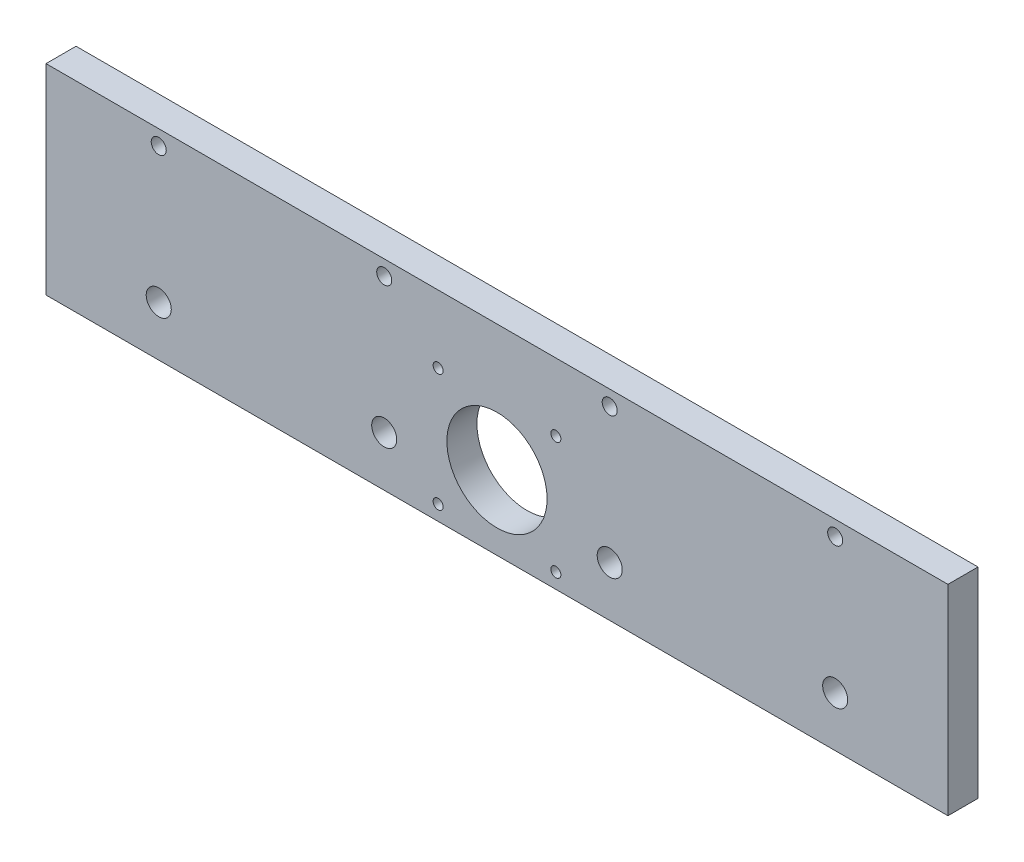
ISO-10303-21;
HEADER;
FILE_DESCRIPTION(('STEP AP214'),'2;1');
FILE_NAME('part.step','',(''),(''),'','','');
FILE_SCHEMA(('AUTOMOTIVE_DESIGN { 1 0 10303 214 1 1 1 1 }'));
ENDSEC;
DATA;
#1=APPLICATION_CONTEXT('core data for automotive mechanical design processes');
#2=APPLICATION_PROTOCOL_DEFINITION('international standard','automotive_design',2000,#1);
#3=PRODUCT_CONTEXT('',#1,'mechanical');
#4=PRODUCT('Part','Part','',(#3));
#5=PRODUCT_RELATED_PRODUCT_CATEGORY('part','',(#4));
#6=PRODUCT_DEFINITION_FORMATION('','',#4);
#7=PRODUCT_DEFINITION_CONTEXT('part definition',#1,'design');
#8=PRODUCT_DEFINITION('design','',#6,#7);
#9=PRODUCT_DEFINITION_SHAPE('','',#8);
#10=(LENGTH_UNIT() NAMED_UNIT(*) SI_UNIT(.MILLI.,.METRE.));
#11=(NAMED_UNIT(*) PLANE_ANGLE_UNIT() SI_UNIT($,.RADIAN.));
#12=(NAMED_UNIT(*) SI_UNIT($,.STERADIAN.) SOLID_ANGLE_UNIT());
#13=UNCERTAINTY_MEASURE_WITH_UNIT(LENGTH_MEASURE(1.E-05),#10,'distance_accuracy_value','');
#14=(GEOMETRIC_REPRESENTATION_CONTEXT(3) GLOBAL_UNCERTAINTY_ASSIGNED_CONTEXT((#13)) GLOBAL_UNIT_ASSIGNED_CONTEXT((#10,
#11,#12)) REPRESENTATION_CONTEXT('',''));
#15=CARTESIAN_POINT('',(0.,0.,0.));
#16=DIRECTION('',(0.,0.,1.));
#17=DIRECTION('',(1.,0.,0.));
#18=AXIS2_PLACEMENT_3D('',#15,#16,#17);
#19=CARTESIAN_POINT('',(180.,40.,12.));
#20=DIRECTION('',(0.,0.,-1.));
#21=DIRECTION('',(-1.,0.,0.));
#22=AXIS2_PLACEMENT_3D('',#19,#20,#21);
#23=PLANE('',#22);
#24=CARTESIAN_POINT('',(23.5,13.,12.));
#25=DIRECTION('',(0.,0.,-1.));
#26=DIRECTION('',(-1.,0.,0.));
#27=AXIS2_PLACEMENT_3D('',#24,#25,#26);
#28=CIRCLE('',#27,2.);
#29=CARTESIAN_POINT('',(21.5,13.,12.));
#30=VERTEX_POINT('',#29);
#31=EDGE_CURVE('E151',#30,#30,#28,.T.);
#32=ORIENTED_EDGE('',*,*,#31,.T.);
#33=EDGE_LOOP('',(#32));
#34=FACE_BOUND('',#33,.T.);
#35=CARTESIAN_POINT('',(-23.5,-34.,12.));
#36=DIRECTION('',(0.,0.,1.));
#37=DIRECTION('',(1.,0.,0.));
#38=AXIS2_PLACEMENT_3D('',#35,#36,#37);
#39=CIRCLE('',#38,2.00000000000001);
#40=CARTESIAN_POINT('',(-21.5,-34.,12.));
#41=VERTEX_POINT('',#40);
#42=EDGE_CURVE('E160',#41,#41,#39,.T.);
#43=ORIENTED_EDGE('',*,*,#42,.F.);
#44=EDGE_LOOP('',(#43));
#45=FACE_BOUND('',#44,.T.);
#46=CARTESIAN_POINT('',(-23.5,13.,12.));
#47=DIRECTION('',(0.,0.,1.));
#48=DIRECTION('',(1.,0.,0.));
#49=AXIS2_PLACEMENT_3D('',#46,#47,#48);
#50=CIRCLE('',#49,2.);
#51=CARTESIAN_POINT('',(-21.5,13.,12.));
#52=VERTEX_POINT('',#51);
#53=EDGE_CURVE('E166',#52,#52,#50,.T.);
#54=ORIENTED_EDGE('',*,*,#53,.F.);
#55=EDGE_LOOP('',(#54));
#56=FACE_BOUND('',#55,.T.);
#57=CARTESIAN_POINT('',(0.,-10.5,12.));
#58=DIRECTION('',(0.,0.,1.));
#59=DIRECTION('',(1.,0.,0.));
#60=AXIS2_PLACEMENT_3D('',#57,#58,#59);
#61=CIRCLE('',#60,20.);
#62=CARTESIAN_POINT('',(20.,-10.5,12.));
#63=VERTEX_POINT('',#62);
#64=EDGE_CURVE('E172',#63,#63,#61,.T.);
#65=ORIENTED_EDGE('',*,*,#64,.F.);
#66=EDGE_LOOP('',(#65));
#67=FACE_BOUND('',#66,.T.);
#68=CARTESIAN_POINT('',(45.,34.,12.));
#69=DIRECTION('',(0.,0.,1.));
#70=DIRECTION('',(1.,0.,0.));
#71=AXIS2_PLACEMENT_3D('',#68,#69,#70);
#72=CIRCLE('',#71,2.99999999999999);
#73=CARTESIAN_POINT('',(48.,34.,12.));
#74=VERTEX_POINT('',#73);
#75=EDGE_CURVE('E180',#74,#74,#72,.T.);
#76=ORIENTED_EDGE('',*,*,#75,.F.);
#77=EDGE_LOOP('',(#76));
#78=FACE_BOUND('',#77,.T.);
#79=CARTESIAN_POINT('',(45.,-20.,12.));
#80=DIRECTION('',(0.,0.,1.));
#81=DIRECTION('',(1.,0.,0.));
#82=AXIS2_PLACEMENT_3D('',#79,#80,#81);
#83=CIRCLE('',#82,4.99999999999999);
#84=CARTESIAN_POINT('',(50.,-20.,12.));
#85=VERTEX_POINT('',#84);
#86=EDGE_CURVE('E186',#85,#85,#83,.T.);
#87=ORIENTED_EDGE('',*,*,#86,.F.);
#88=EDGE_LOOP('',(#87));
#89=FACE_BOUND('',#88,.T.);
#90=CARTESIAN_POINT('',(135.,-20.,12.));
#91=DIRECTION('',(0.,0.,1.));
#92=DIRECTION('',(1.,0.,0.));
#93=AXIS2_PLACEMENT_3D('',#90,#91,#92);
#94=CIRCLE('',#93,4.99999999999999);
#95=CARTESIAN_POINT('',(140.,-20.,12.));
#96=VERTEX_POINT('',#95);
#97=EDGE_CURVE('E190',#96,#96,#94,.T.);
#98=ORIENTED_EDGE('',*,*,#97,.F.);
#99=EDGE_LOOP('',(#98));
#100=FACE_BOUND('',#99,.T.);
#101=CARTESIAN_POINT('',(135.,34.,12.));
#102=DIRECTION('',(0.,0.,1.));
#103=DIRECTION('',(1.,0.,0.));
#104=AXIS2_PLACEMENT_3D('',#101,#102,#103);
#105=CIRCLE('',#104,2.99999999999999);
#106=CARTESIAN_POINT('',(138.,34.,12.));
#107=VERTEX_POINT('',#106);
#108=EDGE_CURVE('E104',#107,#107,#105,.T.);
#109=ORIENTED_EDGE('',*,*,#108,.F.);
#110=EDGE_LOOP('',(#109));
#111=FACE_BOUND('',#110,.T.);
#112=DIRECTION('',(0.,1.,0.));
#113=VECTOR('',#112,1.);
#114=CARTESIAN_POINT('',(180.,-40.,12.));
#115=LINE('',#114,#113);
#116=CARTESIAN_POINT('',(180.,-40.,12.));
#117=VERTEX_POINT('',#116);
#118=CARTESIAN_POINT('',(180.,40.,12.));
#119=VERTEX_POINT('',#118);
#120=EDGE_CURVE('E86',#117,#119,#115,.T.);
#121=ORIENTED_EDGE('',*,*,#120,.T.);
#122=DIRECTION('',(-1.,0.,0.));
#123=VECTOR('',#122,1.);
#124=CARTESIAN_POINT('',(-180.,40.,12.));
#125=LINE('',#124,#123);
#126=CARTESIAN_POINT('',(-180.,40.,12.));
#127=VERTEX_POINT('',#126);
#128=EDGE_CURVE('E81',#119,#127,#125,.T.);
#129=ORIENTED_EDGE('',*,*,#128,.T.);
#130=DIRECTION('',(0.,-1.,0.));
#131=VECTOR('',#130,1.);
#132=CARTESIAN_POINT('',(-180.,-40.,12.));
#133=LINE('',#132,#131);
#134=CARTESIAN_POINT('',(-180.,-40.,12.));
#135=VERTEX_POINT('',#134);
#136=EDGE_CURVE('E84',#127,#135,#133,.T.);
#137=ORIENTED_EDGE('',*,*,#136,.T.);
#138=DIRECTION('',(1.,0.,0.));
#139=VECTOR('',#138,1.);
#140=CARTESIAN_POINT('',(-180.,-40.,12.));
#141=LINE('',#140,#139);
#142=EDGE_CURVE('E50',#135,#117,#141,.T.);
#143=ORIENTED_EDGE('',*,*,#142,.T.);
#144=EDGE_LOOP('',(#121,#129,#137,#143));
#145=FACE_BOUND('',#144,.T.);
#146=CARTESIAN_POINT('',(-45.,-20.,12.));
#147=DIRECTION('',(0.,0.,1.));
#148=DIRECTION('',(1.,0.,0.));
#149=AXIS2_PLACEMENT_3D('',#146,#147,#148);
#150=CIRCLE('',#149,4.99999999999999);
#151=CARTESIAN_POINT('',(-40.,-20.,12.));
#152=VERTEX_POINT('',#151);
#153=EDGE_CURVE('E114',#152,#152,#150,.T.);
#154=ORIENTED_EDGE('',*,*,#153,.F.);
#155=EDGE_LOOP('',(#154));
#156=FACE_BOUND('',#155,.T.);
#157=CARTESIAN_POINT('',(-135.,-20.,12.));
#158=DIRECTION('',(0.,0.,1.));
#159=DIRECTION('',(1.,0.,0.));
#160=AXIS2_PLACEMENT_3D('',#157,#158,#159);
#161=CIRCLE('',#160,4.99999999999999);
#162=CARTESIAN_POINT('',(-130.,-20.,12.));
#163=VERTEX_POINT('',#162);
#164=EDGE_CURVE('E120',#163,#163,#161,.T.);
#165=ORIENTED_EDGE('',*,*,#164,.F.);
#166=EDGE_LOOP('',(#165));
#167=FACE_BOUND('',#166,.T.);
#168=CARTESIAN_POINT('',(-45.,34.,12.));
#169=DIRECTION('',(0.,0.,1.));
#170=DIRECTION('',(1.,0.,0.));
#171=AXIS2_PLACEMENT_3D('',#168,#169,#170);
#172=CIRCLE('',#171,2.99999999999999);
#173=CARTESIAN_POINT('',(-42.,34.,12.));
#174=VERTEX_POINT('',#173);
#175=EDGE_CURVE('E126',#174,#174,#172,.T.);
#176=ORIENTED_EDGE('',*,*,#175,.F.);
#177=EDGE_LOOP('',(#176));
#178=FACE_BOUND('',#177,.T.);
#179=CARTESIAN_POINT('',(-135.,34.,12.));
#180=DIRECTION('',(0.,0.,1.));
#181=DIRECTION('',(1.,0.,0.));
#182=AXIS2_PLACEMENT_3D('',#179,#180,#181);
#183=CIRCLE('',#182,2.99999999999999);
#184=CARTESIAN_POINT('',(-132.,34.,12.));
#185=VERTEX_POINT('',#184);
#186=EDGE_CURVE('E11',#185,#185,#183,.T.);
#187=ORIENTED_EDGE('',*,*,#186,.F.);
#188=EDGE_LOOP('',(#187));
#189=FACE_BOUND('',#188,.T.);
#190=CARTESIAN_POINT('',(23.5,-34.,12.));
#191=DIRECTION('',(0.,0.,-1.));
#192=DIRECTION('',(-1.,0.,0.));
#193=AXIS2_PLACEMENT_3D('',#190,#191,#192);
#194=CIRCLE('',#193,2.00000000000001);
#195=CARTESIAN_POINT('',(21.5,-34.,12.));
#196=VERTEX_POINT('',#195);
#197=EDGE_CURVE('E146',#196,#196,#194,.T.);
#198=ORIENTED_EDGE('',*,*,#197,.T.);
#199=EDGE_LOOP('',(#198));
#200=FACE_BOUND('',#199,.T.);
#201=ADVANCED_FACE('F33',(#34,#45,#56,#67,#78,#89,#100,#111,#145,#156,#167,#178,#189,#200),#23,.F.);
#202=CARTESIAN_POINT('',(180.,40.,0.));
#203=DIRECTION('',(0.,0.,-1.));
#204=DIRECTION('',(-1.,0.,0.));
#205=AXIS2_PLACEMENT_3D('',#202,#203,#204);
#206=PLANE('',#205);
#207=CARTESIAN_POINT('',(23.5,13.,0.));
#208=DIRECTION('',(0.,0.,-1.));
#209=DIRECTION('',(-1.,0.,0.));
#210=AXIS2_PLACEMENT_3D('',#207,#208,#209);
#211=CIRCLE('',#210,2.);
#212=CARTESIAN_POINT('',(21.5,13.,0.));
#213=VERTEX_POINT('',#212);
#214=EDGE_CURVE('E156',#213,#213,#211,.T.);
#215=ORIENTED_EDGE('',*,*,#214,.F.);
#216=EDGE_LOOP('',(#215));
#217=FACE_BOUND('',#216,.T.);
#218=CARTESIAN_POINT('',(-23.5,-34.,0.));
#219=DIRECTION('',(0.,0.,-1.));
#220=DIRECTION('',(-1.,0.,0.));
#221=AXIS2_PLACEMENT_3D('',#218,#219,#220);
#222=CIRCLE('',#221,2.00000000000001);
#223=CARTESIAN_POINT('',(-25.5,-34.,0.));
#224=VERTEX_POINT('',#223);
#225=EDGE_CURVE('E159',#224,#224,#222,.F.);
#226=ORIENTED_EDGE('',*,*,#225,.T.);
#227=EDGE_LOOP('',(#226));
#228=FACE_BOUND('',#227,.T.);
#229=CARTESIAN_POINT('',(-23.5,13.,0.));
#230=DIRECTION('',(0.,0.,-1.));
#231=DIRECTION('',(-1.,0.,0.));
#232=AXIS2_PLACEMENT_3D('',#229,#230,#231);
#233=CIRCLE('',#232,2.);
#234=CARTESIAN_POINT('',(-25.5,13.,0.));
#235=VERTEX_POINT('',#234);
#236=EDGE_CURVE('E163',#235,#235,#233,.F.);
#237=ORIENTED_EDGE('',*,*,#236,.T.);
#238=EDGE_LOOP('',(#237));
#239=FACE_BOUND('',#238,.T.);
#240=CARTESIAN_POINT('',(0.,-10.5,0.));
#241=DIRECTION('',(0.,0.,-1.));
#242=DIRECTION('',(-1.,0.,0.));
#243=AXIS2_PLACEMENT_3D('',#240,#241,#242);
#244=CIRCLE('',#243,20.);
#245=CARTESIAN_POINT('',(-20.,-10.5,0.));
#246=VERTEX_POINT('',#245);
#247=EDGE_CURVE('E169',#246,#246,#244,.F.);
#248=ORIENTED_EDGE('',*,*,#247,.T.);
#249=EDGE_LOOP('',(#248));
#250=FACE_BOUND('',#249,.T.);
#251=CARTESIAN_POINT('',(45.,34.,0.));
#252=DIRECTION('',(0.,0.,-1.));
#253=DIRECTION('',(-1.,0.,0.));
#254=AXIS2_PLACEMENT_3D('',#251,#252,#253);
#255=CIRCLE('',#254,2.99999999999999);
#256=CARTESIAN_POINT('',(42.,34.,0.));
#257=VERTEX_POINT('',#256);
#258=EDGE_CURVE('E175',#257,#257,#255,.F.);
#259=ORIENTED_EDGE('',*,*,#258,.T.);
#260=EDGE_LOOP('',(#259));
#261=FACE_BOUND('',#260,.T.);
#262=CARTESIAN_POINT('',(45.,-20.,0.));
#263=DIRECTION('',(0.,0.,-1.));
#264=DIRECTION('',(-1.,0.,0.));
#265=AXIS2_PLACEMENT_3D('',#262,#263,#264);
#266=CIRCLE('',#265,4.99999999999999);
#267=CARTESIAN_POINT('',(40.,-20.,0.));
#268=VERTEX_POINT('',#267);
#269=EDGE_CURVE('E183',#268,#268,#266,.F.);
#270=ORIENTED_EDGE('',*,*,#269,.T.);
#271=EDGE_LOOP('',(#270));
#272=FACE_BOUND('',#271,.T.);
#273=CARTESIAN_POINT('',(135.,-20.,0.));
#274=DIRECTION('',(0.,0.,-1.));
#275=DIRECTION('',(-1.,0.,0.));
#276=AXIS2_PLACEMENT_3D('',#273,#274,#275);
#277=CIRCLE('',#276,4.99999999999999);
#278=CARTESIAN_POINT('',(130.,-20.,0.));
#279=VERTEX_POINT('',#278);
#280=EDGE_CURVE('E189',#279,#279,#277,.F.);
#281=ORIENTED_EDGE('',*,*,#280,.T.);
#282=EDGE_LOOP('',(#281));
#283=FACE_BOUND('',#282,.T.);
#284=CARTESIAN_POINT('',(135.,34.,0.));
#285=DIRECTION('',(0.,0.,-1.));
#286=DIRECTION('',(-1.,0.,0.));
#287=AXIS2_PLACEMENT_3D('',#284,#285,#286);
#288=CIRCLE('',#287,2.99999999999999);
#289=CARTESIAN_POINT('',(132.,34.,0.));
#290=VERTEX_POINT('',#289);
#291=EDGE_CURVE('E193',#290,#290,#288,.F.);
#292=ORIENTED_EDGE('',*,*,#291,.T.);
#293=EDGE_LOOP('',(#292));
#294=FACE_BOUND('',#293,.T.);
#295=DIRECTION('',(0.,1.,0.));
#296=VECTOR('',#295,1.);
#297=CARTESIAN_POINT('',(180.,-40.,0.));
#298=LINE('',#297,#296);
#299=CARTESIAN_POINT('',(180.,-40.,0.));
#300=VERTEX_POINT('',#299);
#301=CARTESIAN_POINT('',(180.,40.,0.));
#302=VERTEX_POINT('',#301);
#303=EDGE_CURVE('E101',#300,#302,#298,.T.);
#304=ORIENTED_EDGE('',*,*,#303,.F.);
#305=DIRECTION('',(1.,0.,0.));
#306=VECTOR('',#305,1.);
#307=CARTESIAN_POINT('',(-180.,-40.,0.));
#308=LINE('',#307,#306);
#309=CARTESIAN_POINT('',(-180.,-40.,0.));
#310=VERTEX_POINT('',#309);
#311=EDGE_CURVE('E73',#310,#300,#308,.T.);
#312=ORIENTED_EDGE('',*,*,#311,.F.);
#313=DIRECTION('',(0.,-1.,0.));
#314=VECTOR('',#313,1.);
#315=CARTESIAN_POINT('',(-180.,-40.,0.));
#316=LINE('',#315,#314);
#317=CARTESIAN_POINT('',(-180.,40.,0.));
#318=VERTEX_POINT('',#317);
#319=EDGE_CURVE('E67',#318,#310,#316,.T.);
#320=ORIENTED_EDGE('',*,*,#319,.F.);
#321=DIRECTION('',(-1.,0.,0.));
#322=VECTOR('',#321,1.);
#323=CARTESIAN_POINT('',(-180.,40.,0.));
#324=LINE('',#323,#322);
#325=EDGE_CURVE('E91',#302,#318,#324,.T.);
#326=ORIENTED_EDGE('',*,*,#325,.F.);
#327=EDGE_LOOP('',(#304,#312,#320,#326));
#328=FACE_BOUND('',#327,.T.);
#329=CARTESIAN_POINT('',(-45.,-20.,0.));
#330=DIRECTION('',(0.,0.,-1.));
#331=DIRECTION('',(-1.,0.,0.));
#332=AXIS2_PLACEMENT_3D('',#329,#330,#331);
#333=CIRCLE('',#332,4.99999999999999);
#334=CARTESIAN_POINT('',(-50.,-20.,0.));
#335=VERTEX_POINT('',#334);
#336=EDGE_CURVE('E111',#335,#335,#333,.F.);
#337=ORIENTED_EDGE('',*,*,#336,.T.);
#338=EDGE_LOOP('',(#337));
#339=FACE_BOUND('',#338,.T.);
#340=CARTESIAN_POINT('',(-135.,-20.,0.));
#341=DIRECTION('',(0.,0.,-1.));
#342=DIRECTION('',(-1.,0.,0.));
#343=AXIS2_PLACEMENT_3D('',#340,#341,#342);
#344=CIRCLE('',#343,4.99999999999999);
#345=CARTESIAN_POINT('',(-140.,-20.,0.));
#346=VERTEX_POINT('',#345);
#347=EDGE_CURVE('E117',#346,#346,#344,.F.);
#348=ORIENTED_EDGE('',*,*,#347,.T.);
#349=EDGE_LOOP('',(#348));
#350=FACE_BOUND('',#349,.T.);
#351=CARTESIAN_POINT('',(-45.,34.,0.));
#352=DIRECTION('',(0.,0.,-1.));
#353=DIRECTION('',(-1.,0.,0.));
#354=AXIS2_PLACEMENT_3D('',#351,#352,#353);
#355=CIRCLE('',#354,2.99999999999999);
#356=CARTESIAN_POINT('',(-48.,34.,0.));
#357=VERTEX_POINT('',#356);
#358=EDGE_CURVE('E123',#357,#357,#355,.F.);
#359=ORIENTED_EDGE('',*,*,#358,.T.);
#360=EDGE_LOOP('',(#359));
#361=FACE_BOUND('',#360,.T.);
#362=CARTESIAN_POINT('',(-135.,34.,0.));
#363=DIRECTION('',(0.,0.,-1.));
#364=DIRECTION('',(-1.,0.,0.));
#365=AXIS2_PLACEMENT_3D('',#362,#363,#364);
#366=CIRCLE('',#365,2.99999999999999);
#367=CARTESIAN_POINT('',(-138.,34.,0.));
#368=VERTEX_POINT('',#367);
#369=EDGE_CURVE('E42',#368,#368,#366,.F.);
#370=ORIENTED_EDGE('',*,*,#369,.T.);
#371=EDGE_LOOP('',(#370));
#372=FACE_BOUND('',#371,.T.);
#373=CARTESIAN_POINT('',(23.5,-34.,0.));
#374=DIRECTION('',(0.,0.,-1.));
#375=DIRECTION('',(-1.,0.,0.));
#376=AXIS2_PLACEMENT_3D('',#373,#374,#375);
#377=CIRCLE('',#376,2.00000000000001);
#378=CARTESIAN_POINT('',(21.5,-34.,0.));
#379=VERTEX_POINT('',#378);
#380=EDGE_CURVE('E148',#379,#379,#377,.T.);
#381=ORIENTED_EDGE('',*,*,#380,.F.);
#382=EDGE_LOOP('',(#381));
#383=FACE_BOUND('',#382,.T.);
#384=ADVANCED_FACE('F131',(#217,#228,#239,#250,#261,#272,#283,#294,#328,#339,#350,#361,#372,
#383),#206,.T.);
#385=CARTESIAN_POINT('',(180.,-40.,12.));
#386=DIRECTION('',(-1.,0.,0.));
#387=DIRECTION('',(0.,0.,1.));
#388=AXIS2_PLACEMENT_3D('',#385,#386,#387);
#389=PLANE('',#388);
#390=ORIENTED_EDGE('',*,*,#303,.T.);
#391=DIRECTION('',(0.,0.,-1.));
#392=VECTOR('',#391,1.);
#393=CARTESIAN_POINT('',(180.,40.,12.));
#394=LINE('',#393,#392);
#395=EDGE_CURVE('E92',#119,#302,#394,.T.);
#396=ORIENTED_EDGE('',*,*,#395,.F.);
#397=ORIENTED_EDGE('',*,*,#120,.F.);
#398=DIRECTION('',(0.,0.,-1.));
#399=VECTOR('',#398,1.);
#400=CARTESIAN_POINT('',(180.,-40.,12.));
#401=LINE('',#400,#399);
#402=EDGE_CURVE('E97',#117,#300,#401,.T.);
#403=ORIENTED_EDGE('',*,*,#402,.T.);
#404=EDGE_LOOP('',(#390,#396,#397,#403));
#405=FACE_BOUND('',#404,.T.);
#406=ADVANCED_FACE('F223',(#405),#389,.F.);
#407=CARTESIAN_POINT('',(-180.,40.,12.));
#408=DIRECTION('',(0.,-1.,0.));
#409=DIRECTION('',(0.,0.,-1.));
#410=AXIS2_PLACEMENT_3D('',#407,#408,#409);
#411=PLANE('',#410);
#412=ORIENTED_EDGE('',*,*,#325,.T.);
#413=DIRECTION('',(0.,0.,-1.));
#414=VECTOR('',#413,1.);
#415=CARTESIAN_POINT('',(-180.,40.,12.));
#416=LINE('',#415,#414);
#417=EDGE_CURVE('E89',#127,#318,#416,.T.);
#418=ORIENTED_EDGE('',*,*,#417,.F.);
#419=ORIENTED_EDGE('',*,*,#128,.F.);
#420=ORIENTED_EDGE('',*,*,#395,.T.);
#421=EDGE_LOOP('',(#412,#418,#419,#420));
#422=FACE_BOUND('',#421,.T.);
#423=ADVANCED_FACE('F90',(#422),#411,.F.);
#424=CARTESIAN_POINT('',(-180.,-40.,12.));
#425=DIRECTION('',(1.,0.,0.));
#426=DIRECTION('',(0.,0.,-1.));
#427=AXIS2_PLACEMENT_3D('',#424,#425,#426);
#428=PLANE('',#427);
#429=ORIENTED_EDGE('',*,*,#319,.T.);
#430=DIRECTION('',(0.,0.,-1.));
#431=VECTOR('',#430,1.);
#432=CARTESIAN_POINT('',(-180.,-40.,12.));
#433=LINE('',#432,#431);
#434=EDGE_CURVE('E93',#135,#310,#433,.T.);
#435=ORIENTED_EDGE('',*,*,#434,.F.);
#436=ORIENTED_EDGE('',*,*,#136,.F.);
#437=ORIENTED_EDGE('',*,*,#417,.T.);
#438=EDGE_LOOP('',(#429,#435,#436,#437));
#439=FACE_BOUND('',#438,.T.);
#440=ADVANCED_FACE('F95',(#439),#428,.F.);
#441=CARTESIAN_POINT('',(-180.,-40.,12.));
#442=DIRECTION('',(0.,1.,0.));
#443=DIRECTION('',(0.,0.,1.));
#444=AXIS2_PLACEMENT_3D('',#441,#442,#443);
#445=PLANE('',#444);
#446=ORIENTED_EDGE('',*,*,#311,.T.);
#447=ORIENTED_EDGE('',*,*,#402,.F.);
#448=ORIENTED_EDGE('',*,*,#142,.F.);
#449=ORIENTED_EDGE('',*,*,#434,.T.);
#450=EDGE_LOOP('',(#446,#447,#448,#449));
#451=FACE_BOUND('',#450,.T.);
#452=ADVANCED_FACE('F207',(#451),#445,.F.);
#453=CARTESIAN_POINT('',(135.,34.,-0.000999999999999265));
#454=DIRECTION('',(0.,0.,1.));
#455=DIRECTION('',(1.,0.,0.));
#456=AXIS2_PLACEMENT_3D('',#453,#454,#455);
#457=CYLINDRICAL_SURFACE('',#456,2.99999999999999);
#458=ORIENTED_EDGE('',*,*,#291,.F.);
#459=EDGE_LOOP('',(#458));
#460=FACE_BOUND('',#459,.T.);
#461=ORIENTED_EDGE('',*,*,#108,.T.);
#462=EDGE_LOOP('',(#461));
#463=FACE_BOUND('',#462,.T.);
#464=ADVANCED_FACE('F203',(#460,#463),#457,.F.);
#465=CARTESIAN_POINT('',(135.,-20.,-0.000999999999999265));
#466=DIRECTION('',(0.,0.,1.));
#467=DIRECTION('',(1.,0.,0.));
#468=AXIS2_PLACEMENT_3D('',#465,#466,#467);
#469=CYLINDRICAL_SURFACE('',#468,4.99999999999999);
#470=ORIENTED_EDGE('',*,*,#280,.F.);
#471=EDGE_LOOP('',(#470));
#472=FACE_BOUND('',#471,.T.);
#473=ORIENTED_EDGE('',*,*,#97,.T.);
#474=EDGE_LOOP('',(#473));
#475=FACE_BOUND('',#474,.T.);
#476=ADVANCED_FACE('F206',(#472,#475),#469,.F.);
#477=CARTESIAN_POINT('',(45.,-20.,-0.000999999999999265));
#478=DIRECTION('',(0.,0.,1.));
#479=DIRECTION('',(1.,0.,0.));
#480=AXIS2_PLACEMENT_3D('',#477,#478,#479);
#481=CYLINDRICAL_SURFACE('',#480,4.99999999999999);
#482=ORIENTED_EDGE('',*,*,#269,.F.);
#483=EDGE_LOOP('',(#482));
#484=FACE_BOUND('',#483,.T.);
#485=ORIENTED_EDGE('',*,*,#86,.T.);
#486=EDGE_LOOP('',(#485));
#487=FACE_BOUND('',#486,.T.);
#488=ADVANCED_FACE('F215',(#484,#487),#481,.F.);
#489=CARTESIAN_POINT('',(-45.,-20.,-0.000999999999999265));
#490=DIRECTION('',(0.,0.,1.));
#491=DIRECTION('',(1.,0.,0.));
#492=AXIS2_PLACEMENT_3D('',#489,#490,#491);
#493=CYLINDRICAL_SURFACE('',#492,4.99999999999999);
#494=ORIENTED_EDGE('',*,*,#336,.F.);
#495=EDGE_LOOP('',(#494));
#496=FACE_BOUND('',#495,.T.);
#497=ORIENTED_EDGE('',*,*,#153,.T.);
#498=EDGE_LOOP('',(#497));
#499=FACE_BOUND('',#498,.T.);
#500=ADVANCED_FACE('F233',(#496,#499),#493,.F.);
#501=CARTESIAN_POINT('',(-135.,-20.,-0.000999999999999265));
#502=DIRECTION('',(0.,0.,1.));
#503=DIRECTION('',(1.,0.,0.));
#504=AXIS2_PLACEMENT_3D('',#501,#502,#503);
#505=CYLINDRICAL_SURFACE('',#504,4.99999999999999);
#506=ORIENTED_EDGE('',*,*,#347,.F.);
#507=EDGE_LOOP('',(#506));
#508=FACE_BOUND('',#507,.T.);
#509=ORIENTED_EDGE('',*,*,#164,.T.);
#510=EDGE_LOOP('',(#509));
#511=FACE_BOUND('',#510,.T.);
#512=ADVANCED_FACE('F236',(#508,#511),#505,.F.);
#513=CARTESIAN_POINT('',(45.,34.,-0.000999999999999265));
#514=DIRECTION('',(0.,0.,1.));
#515=DIRECTION('',(1.,0.,0.));
#516=AXIS2_PLACEMENT_3D('',#513,#514,#515);
#517=CYLINDRICAL_SURFACE('',#516,2.99999999999999);
#518=ORIENTED_EDGE('',*,*,#258,.F.);
#519=EDGE_LOOP('',(#518));
#520=FACE_BOUND('',#519,.T.);
#521=ORIENTED_EDGE('',*,*,#75,.T.);
#522=EDGE_LOOP('',(#521));
#523=FACE_BOUND('',#522,.T.);
#524=ADVANCED_FACE('F239',(#520,#523),#517,.F.);
#525=CARTESIAN_POINT('',(-45.,34.,-0.000999999999999265));
#526=DIRECTION('',(0.,0.,1.));
#527=DIRECTION('',(1.,0.,0.));
#528=AXIS2_PLACEMENT_3D('',#525,#526,#527);
#529=CYLINDRICAL_SURFACE('',#528,2.99999999999999);
#530=ORIENTED_EDGE('',*,*,#358,.F.);
#531=EDGE_LOOP('',(#530));
#532=FACE_BOUND('',#531,.T.);
#533=ORIENTED_EDGE('',*,*,#175,.T.);
#534=EDGE_LOOP('',(#533));
#535=FACE_BOUND('',#534,.T.);
#536=ADVANCED_FACE('F137',(#532,#535),#529,.F.);
#537=CARTESIAN_POINT('',(-135.,34.,-0.000999999999999265));
#538=DIRECTION('',(0.,0.,1.));
#539=DIRECTION('',(1.,0.,0.));
#540=AXIS2_PLACEMENT_3D('',#537,#538,#539);
#541=CYLINDRICAL_SURFACE('',#540,2.99999999999999);
#542=ORIENTED_EDGE('',*,*,#369,.F.);
#543=EDGE_LOOP('',(#542));
#544=FACE_BOUND('',#543,.T.);
#545=ORIENTED_EDGE('',*,*,#186,.T.);
#546=EDGE_LOOP('',(#545));
#547=FACE_BOUND('',#546,.T.);
#548=ADVANCED_FACE('F35',(#544,#547),#541,.F.);
#549=CARTESIAN_POINT('',(0.,-10.5,-0.000999999999999265));
#550=DIRECTION('',(0.,0.,1.));
#551=DIRECTION('',(1.,0.,0.));
#552=AXIS2_PLACEMENT_3D('',#549,#550,#551);
#553=CYLINDRICAL_SURFACE('',#552,20.);
#554=ORIENTED_EDGE('',*,*,#247,.F.);
#555=EDGE_LOOP('',(#554));
#556=FACE_BOUND('',#555,.T.);
#557=ORIENTED_EDGE('',*,*,#64,.T.);
#558=EDGE_LOOP('',(#557));
#559=FACE_BOUND('',#558,.T.);
#560=ADVANCED_FACE('F136',(#556,#559),#553,.F.);
#561=CARTESIAN_POINT('',(-23.5,13.,-0.000999999999999265));
#562=DIRECTION('',(0.,0.,1.));
#563=DIRECTION('',(1.,0.,0.));
#564=AXIS2_PLACEMENT_3D('',#561,#562,#563);
#565=CYLINDRICAL_SURFACE('',#564,2.);
#566=ORIENTED_EDGE('',*,*,#236,.F.);
#567=EDGE_LOOP('',(#566));
#568=FACE_BOUND('',#567,.T.);
#569=ORIENTED_EDGE('',*,*,#53,.T.);
#570=EDGE_LOOP('',(#569));
#571=FACE_BOUND('',#570,.T.);
#572=ADVANCED_FACE('F306',(#568,#571),#565,.F.);
#573=CARTESIAN_POINT('',(-23.5,-34.,-0.000999999999999265));
#574=DIRECTION('',(0.,0.,1.));
#575=DIRECTION('',(1.,0.,0.));
#576=AXIS2_PLACEMENT_3D('',#573,#574,#575);
#577=CYLINDRICAL_SURFACE('',#576,2.00000000000001);
#578=ORIENTED_EDGE('',*,*,#225,.F.);
#579=EDGE_LOOP('',(#578));
#580=FACE_BOUND('',#579,.T.);
#581=ORIENTED_EDGE('',*,*,#42,.T.);
#582=EDGE_LOOP('',(#581));
#583=FACE_BOUND('',#582,.T.);
#584=ADVANCED_FACE('F315',(#580,#583),#577,.F.);
#585=CARTESIAN_POINT('',(23.5,13.,-0.000999999999999265));
#586=DIRECTION('',(0.,0.,1.));
#587=DIRECTION('',(1.,0.,0.));
#588=AXIS2_PLACEMENT_3D('',#585,#586,#587);
#589=CYLINDRICAL_SURFACE('',#588,2.);
#590=ORIENTED_EDGE('',*,*,#214,.T.);
#591=EDGE_LOOP('',(#590));
#592=FACE_BOUND('',#591,.T.);
#593=ORIENTED_EDGE('',*,*,#31,.F.);
#594=EDGE_LOOP('',(#593));
#595=FACE_BOUND('',#594,.T.);
#596=ADVANCED_FACE('F323',(#592,#595),#589,.F.);
#597=CARTESIAN_POINT('',(23.5,-34.,-0.000999999999999265));
#598=DIRECTION('',(0.,0.,1.));
#599=DIRECTION('',(1.,0.,0.));
#600=AXIS2_PLACEMENT_3D('',#597,#598,#599);
#601=CYLINDRICAL_SURFACE('',#600,2.00000000000001);
#602=ORIENTED_EDGE('',*,*,#380,.T.);
#603=EDGE_LOOP('',(#602));
#604=FACE_BOUND('',#603,.T.);
#605=ORIENTED_EDGE('',*,*,#197,.F.);
#606=EDGE_LOOP('',(#605));
#607=FACE_BOUND('',#606,.T.);
#608=ADVANCED_FACE('F341',(#604,#607),#601,.F.);
#609=CLOSED_SHELL('',(#201,#384,#406,#423,#440,#452,#464,#476,#488,#500,#512,#524,#536,#548,
#560,#572,#584,#596,#608));
#610=MANIFOLD_SOLID_BREP('B2',#609);
#611=ADVANCED_BREP_SHAPE_REPRESENTATION('',(#18,#610),#14);
#612=SHAPE_DEFINITION_REPRESENTATION(#9,#611);
ENDSEC;
END-ISO-10303-21;
